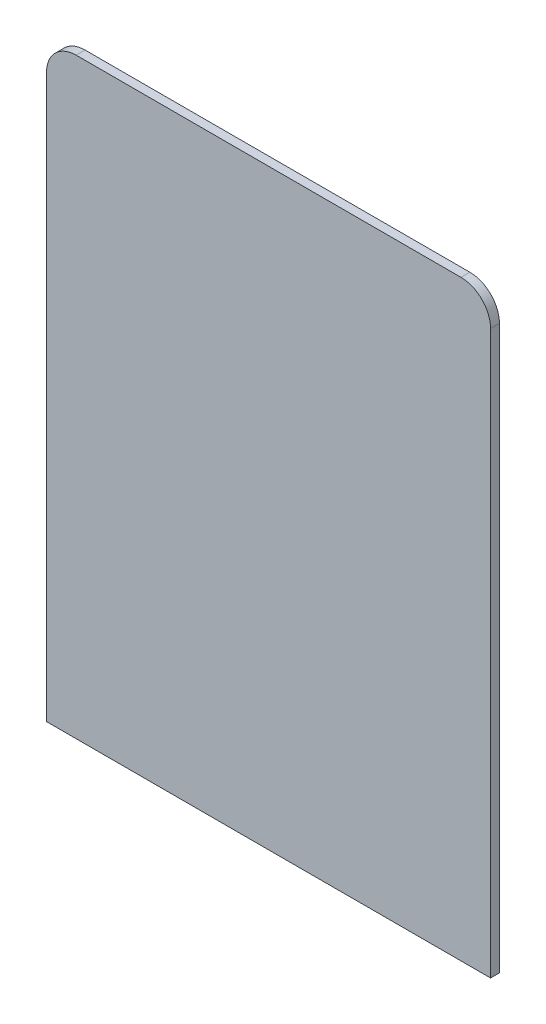
ISO-10303-21;
HEADER;
FILE_DESCRIPTION(('STEP AP214'),'2;1');
FILE_NAME('part.step','',(''),(''),'','','');
FILE_SCHEMA(('AUTOMOTIVE_DESIGN { 1 0 10303 214 1 1 1 1 }'));
ENDSEC;
DATA;
#1=APPLICATION_CONTEXT('core data for automotive mechanical design processes');
#2=APPLICATION_PROTOCOL_DEFINITION('international standard','automotive_design',2000,#1);
#3=PRODUCT_CONTEXT('',#1,'mechanical');
#4=PRODUCT('Part','Part','',(#3));
#5=PRODUCT_RELATED_PRODUCT_CATEGORY('part','',(#4));
#6=PRODUCT_DEFINITION_FORMATION('','',#4);
#7=PRODUCT_DEFINITION_CONTEXT('part definition',#1,'design');
#8=PRODUCT_DEFINITION('design','',#6,#7);
#9=PRODUCT_DEFINITION_SHAPE('','',#8);
#10=(LENGTH_UNIT() NAMED_UNIT(*) SI_UNIT(.MILLI.,.METRE.));
#11=(NAMED_UNIT(*) PLANE_ANGLE_UNIT() SI_UNIT($,.RADIAN.));
#12=(NAMED_UNIT(*) SI_UNIT($,.STERADIAN.) SOLID_ANGLE_UNIT());
#13=UNCERTAINTY_MEASURE_WITH_UNIT(LENGTH_MEASURE(1.E-05),#10,'distance_accuracy_value','');
#14=(GEOMETRIC_REPRESENTATION_CONTEXT(3) GLOBAL_UNCERTAINTY_ASSIGNED_CONTEXT((#13)) GLOBAL_UNIT_ASSIGNED_CONTEXT((#10,
#11,#12)) REPRESENTATION_CONTEXT('',''));
#15=CARTESIAN_POINT('',(0.,0.,0.));
#16=DIRECTION('',(0.,0.,1.));
#17=DIRECTION('',(1.,0.,0.));
#18=AXIS2_PLACEMENT_3D('',#15,#16,#17);
#19=CARTESIAN_POINT('',(75.,89.9999999999999,1.5));
#20=DIRECTION('',(-1.,0.,0.));
#21=DIRECTION('',(0.,-1.,0.));
#22=AXIS2_PLACEMENT_3D('',#19,#20,#21);
#23=PLANE('',#22);
#24=DIRECTION('',(0.,1.,0.));
#25=VECTOR('',#24,1.);
#26=CARTESIAN_POINT('',(75.,89.9999999999999,-1.5));
#27=LINE('',#26,#25);
#28=CARTESIAN_POINT('',(75.,-100.,-1.5));
#29=VERTEX_POINT('',#28);
#30=CARTESIAN_POINT('',(75.,89.9999999999999,-1.5));
#31=VERTEX_POINT('',#30);
#32=EDGE_CURVE('E125',#29,#31,#27,.T.);
#33=ORIENTED_EDGE('',*,*,#32,.T.);
#34=DIRECTION('',(0.,0.,-1.));
#35=VECTOR('',#34,1.);
#36=CARTESIAN_POINT('',(75.,89.9999999999999,1.5));
#37=LINE('',#36,#35);
#38=CARTESIAN_POINT('',(75.,89.9999999999999,1.5));
#39=VERTEX_POINT('',#38);
#40=EDGE_CURVE('E11',#39,#31,#37,.T.);
#41=ORIENTED_EDGE('',*,*,#40,.F.);
#42=DIRECTION('',(0.,1.,0.));
#43=VECTOR('',#42,1.);
#44=CARTESIAN_POINT('',(75.,89.9999999999999,1.5));
#45=LINE('',#44,#43);
#46=CARTESIAN_POINT('',(75.,-100.,1.5));
#47=VERTEX_POINT('',#46);
#48=EDGE_CURVE('E135',#47,#39,#45,.T.);
#49=ORIENTED_EDGE('',*,*,#48,.F.);
#50=DIRECTION('',(0.,0.,-1.));
#51=VECTOR('',#50,1.);
#52=CARTESIAN_POINT('',(75.,-100.,1.5));
#53=LINE('',#52,#51);
#54=EDGE_CURVE('E121',#47,#29,#53,.T.);
#55=ORIENTED_EDGE('',*,*,#54,.T.);
#56=EDGE_LOOP('',(#33,#41,#49,#55));
#57=FACE_BOUND('',#56,.T.);
#58=ADVANCED_FACE('F41',(#57),#23,.F.);
#59=CARTESIAN_POINT('',(65.,90.,1.5));
#60=DIRECTION('',(0.,0.,-1.));
#61=DIRECTION('',(-1.,0.,0.));
#62=AXIS2_PLACEMENT_3D('',#59,#60,#61);
#63=CYLINDRICAL_SURFACE('',#62,9.99999999999999);
#64=CARTESIAN_POINT('',(65.,90.,-1.5));
#65=DIRECTION('',(0.,0.,1.));
#66=DIRECTION('',(1.,0.,0.));
#67=AXIS2_PLACEMENT_3D('',#64,#65,#66);
#68=CIRCLE('',#67,9.99999999999999);
#69=CARTESIAN_POINT('',(64.9999999999999,100.,-1.5));
#70=VERTEX_POINT('',#69);
#71=EDGE_CURVE('E128',#31,#70,#68,.T.);
#72=ORIENTED_EDGE('',*,*,#71,.T.);
#73=DIRECTION('',(0.,0.,-1.));
#74=VECTOR('',#73,1.);
#75=CARTESIAN_POINT('',(64.9999999999999,100.,1.5));
#76=LINE('',#75,#74);
#77=CARTESIAN_POINT('',(64.9999999999999,100.,1.5));
#78=VERTEX_POINT('',#77);
#79=EDGE_CURVE('E49',#78,#70,#76,.T.);
#80=ORIENTED_EDGE('',*,*,#79,.F.);
#81=CARTESIAN_POINT('',(65.,90.,1.5));
#82=DIRECTION('',(0.,0.,1.));
#83=DIRECTION('',(1.,0.,0.));
#84=AXIS2_PLACEMENT_3D('',#81,#82,#83);
#85=CIRCLE('',#84,9.99999999999999);
#86=EDGE_CURVE('E94',#39,#78,#85,.T.);
#87=ORIENTED_EDGE('',*,*,#86,.F.);
#88=ORIENTED_EDGE('',*,*,#40,.T.);
#89=EDGE_LOOP('',(#72,#80,#87,#88));
#90=FACE_BOUND('',#89,.T.);
#91=ADVANCED_FACE('F159',(#90),#63,.T.);
#92=CARTESIAN_POINT('',(-64.9999999999999,100.,1.5));
#93=DIRECTION('',(0.,-1.,0.));
#94=DIRECTION('',(0.,0.,-1.));
#95=AXIS2_PLACEMENT_3D('',#92,#93,#94);
#96=PLANE('',#95);
#97=DIRECTION('',(-1.,0.,0.));
#98=VECTOR('',#97,1.);
#99=CARTESIAN_POINT('',(-64.9999999999999,100.,-1.5));
#100=LINE('',#99,#98);
#101=CARTESIAN_POINT('',(-64.9999999999999,100.,-1.5));
#102=VERTEX_POINT('',#101);
#103=EDGE_CURVE('E130',#70,#102,#100,.T.);
#104=ORIENTED_EDGE('',*,*,#103,.T.);
#105=DIRECTION('',(0.,0.,-1.));
#106=VECTOR('',#105,1.);
#107=CARTESIAN_POINT('',(-64.9999999999999,100.,1.5));
#108=LINE('',#107,#106);
#109=CARTESIAN_POINT('',(-64.9999999999999,100.,1.5));
#110=VERTEX_POINT('',#109);
#111=EDGE_CURVE('E116',#110,#102,#108,.T.);
#112=ORIENTED_EDGE('',*,*,#111,.F.);
#113=DIRECTION('',(-1.,0.,0.));
#114=VECTOR('',#113,1.);
#115=CARTESIAN_POINT('',(-64.9999999999999,100.,1.5));
#116=LINE('',#115,#114);
#117=EDGE_CURVE('E107',#78,#110,#116,.T.);
#118=ORIENTED_EDGE('',*,*,#117,.F.);
#119=ORIENTED_EDGE('',*,*,#79,.T.);
#120=EDGE_LOOP('',(#104,#112,#118,#119));
#121=FACE_BOUND('',#120,.T.);
#122=ADVANCED_FACE('F141',(#121),#96,.F.);
#123=CARTESIAN_POINT('',(-65.,90.,1.5));
#124=DIRECTION('',(0.,0.,-1.));
#125=DIRECTION('',(-1.,0.,0.));
#126=AXIS2_PLACEMENT_3D('',#123,#124,#125);
#127=CYLINDRICAL_SURFACE('',#126,9.99999999999999);
#128=CARTESIAN_POINT('',(-65.,90.,-1.5));
#129=DIRECTION('',(0.,0.,1.));
#130=DIRECTION('',(1.,0.,0.));
#131=AXIS2_PLACEMENT_3D('',#128,#129,#130);
#132=CIRCLE('',#131,9.99999999999999);
#133=CARTESIAN_POINT('',(-75.,89.9999999999999,-1.5));
#134=VERTEX_POINT('',#133);
#135=EDGE_CURVE('E115',#102,#134,#132,.T.);
#136=ORIENTED_EDGE('',*,*,#135,.T.);
#137=DIRECTION('',(0.,0.,-1.));
#138=VECTOR('',#137,1.);
#139=CARTESIAN_POINT('',(-75.,89.9999999999999,1.5));
#140=LINE('',#139,#138);
#141=CARTESIAN_POINT('',(-75.,89.9999999999999,1.5));
#142=VERTEX_POINT('',#141);
#143=EDGE_CURVE('E112',#142,#134,#140,.T.);
#144=ORIENTED_EDGE('',*,*,#143,.F.);
#145=CARTESIAN_POINT('',(-65.,90.,1.5));
#146=DIRECTION('',(0.,0.,1.));
#147=DIRECTION('',(1.,0.,0.));
#148=AXIS2_PLACEMENT_3D('',#145,#146,#147);
#149=CIRCLE('',#148,9.99999999999999);
#150=EDGE_CURVE('E101',#110,#142,#149,.T.);
#151=ORIENTED_EDGE('',*,*,#150,.F.);
#152=ORIENTED_EDGE('',*,*,#111,.T.);
#153=EDGE_LOOP('',(#136,#144,#151,#152));
#154=FACE_BOUND('',#153,.T.);
#155=ADVANCED_FACE('F113',(#154),#127,.T.);
#156=CARTESIAN_POINT('',(-75.,89.9999999999999,1.5));
#157=DIRECTION('',(1.,0.,0.));
#158=DIRECTION('',(0.,1.,0.));
#159=AXIS2_PLACEMENT_3D('',#156,#157,#158);
#160=PLANE('',#159);
#161=DIRECTION('',(0.,-1.,0.));
#162=VECTOR('',#161,1.);
#163=CARTESIAN_POINT('',(-75.,89.9999999999999,-1.5));
#164=LINE('',#163,#162);
#165=CARTESIAN_POINT('',(-75.,-100.,-1.5));
#166=VERTEX_POINT('',#165);
#167=EDGE_CURVE('E80',#134,#166,#164,.T.);
#168=ORIENTED_EDGE('',*,*,#167,.T.);
#169=DIRECTION('',(0.,0.,-1.));
#170=VECTOR('',#169,1.);
#171=CARTESIAN_POINT('',(-75.,-100.,1.5));
#172=LINE('',#171,#170);
#173=CARTESIAN_POINT('',(-75.,-100.,1.5));
#174=VERTEX_POINT('',#173);
#175=EDGE_CURVE('E117',#174,#166,#172,.T.);
#176=ORIENTED_EDGE('',*,*,#175,.F.);
#177=DIRECTION('',(0.,-1.,0.));
#178=VECTOR('',#177,1.);
#179=CARTESIAN_POINT('',(-75.,89.9999999999999,1.5));
#180=LINE('',#179,#178);
#181=EDGE_CURVE('E105',#142,#174,#180,.T.);
#182=ORIENTED_EDGE('',*,*,#181,.F.);
#183=ORIENTED_EDGE('',*,*,#143,.T.);
#184=EDGE_LOOP('',(#168,#176,#182,#183));
#185=FACE_BOUND('',#184,.T.);
#186=ADVANCED_FACE('F119',(#185),#160,.F.);
#187=CARTESIAN_POINT('',(-75.,-100.,1.5));
#188=DIRECTION('',(0.,1.,0.));
#189=DIRECTION('',(0.,0.,1.));
#190=AXIS2_PLACEMENT_3D('',#187,#188,#189);
#191=PLANE('',#190);
#192=DIRECTION('',(1.,0.,0.));
#193=VECTOR('',#192,1.);
#194=CARTESIAN_POINT('',(-75.,-100.,-1.5));
#195=LINE('',#194,#193);
#196=EDGE_CURVE('E86',#166,#29,#195,.T.);
#197=ORIENTED_EDGE('',*,*,#196,.T.);
#198=ORIENTED_EDGE('',*,*,#54,.F.);
#199=DIRECTION('',(1.,0.,0.));
#200=VECTOR('',#199,1.);
#201=CARTESIAN_POINT('',(-75.,-100.,1.5));
#202=LINE('',#201,#200);
#203=EDGE_CURVE('E57',#174,#47,#202,.T.);
#204=ORIENTED_EDGE('',*,*,#203,.F.);
#205=ORIENTED_EDGE('',*,*,#175,.T.);
#206=EDGE_LOOP('',(#197,#198,#204,#205));
#207=FACE_BOUND('',#206,.T.);
#208=ADVANCED_FACE('F148',(#207),#191,.F.);
#209=CARTESIAN_POINT('',(-65.,90.,1.5));
#210=DIRECTION('',(0.,0.,1.));
#211=DIRECTION('',(1.,0.,0.));
#212=AXIS2_PLACEMENT_3D('',#209,#210,#211);
#213=PLANE('',#212);
#214=ORIENTED_EDGE('',*,*,#48,.T.);
#215=ORIENTED_EDGE('',*,*,#86,.T.);
#216=ORIENTED_EDGE('',*,*,#117,.T.);
#217=ORIENTED_EDGE('',*,*,#150,.T.);
#218=ORIENTED_EDGE('',*,*,#181,.T.);
#219=ORIENTED_EDGE('',*,*,#203,.T.);
#220=EDGE_LOOP('',(#214,#215,#216,#217,#218,#219));
#221=FACE_BOUND('',#220,.T.);
#222=ADVANCED_FACE('F103',(#221),#213,.T.);
#223=CARTESIAN_POINT('',(-65.,90.,-1.5));
#224=DIRECTION('',(0.,0.,1.));
#225=DIRECTION('',(1.,0.,0.));
#226=AXIS2_PLACEMENT_3D('',#223,#224,#225);
#227=PLANE('',#226);
#228=ORIENTED_EDGE('',*,*,#32,.F.);
#229=ORIENTED_EDGE('',*,*,#196,.F.);
#230=ORIENTED_EDGE('',*,*,#167,.F.);
#231=ORIENTED_EDGE('',*,*,#135,.F.);
#232=ORIENTED_EDGE('',*,*,#103,.F.);
#233=ORIENTED_EDGE('',*,*,#71,.F.);
#234=EDGE_LOOP('',(#228,#229,#230,#231,#232,#233));
#235=FACE_BOUND('',#234,.T.);
#236=ADVANCED_FACE('F144',(#235),#227,.F.);
#237=CLOSED_SHELL('',(#58,#91,#122,#155,#186,#208,#222,#236));
#238=MANIFOLD_SOLID_BREP('B2',#237);
#239=ADVANCED_BREP_SHAPE_REPRESENTATION('',(#18,#238),#14);
#240=SHAPE_DEFINITION_REPRESENTATION(#9,#239);
ENDSEC;
END-ISO-10303-21;
